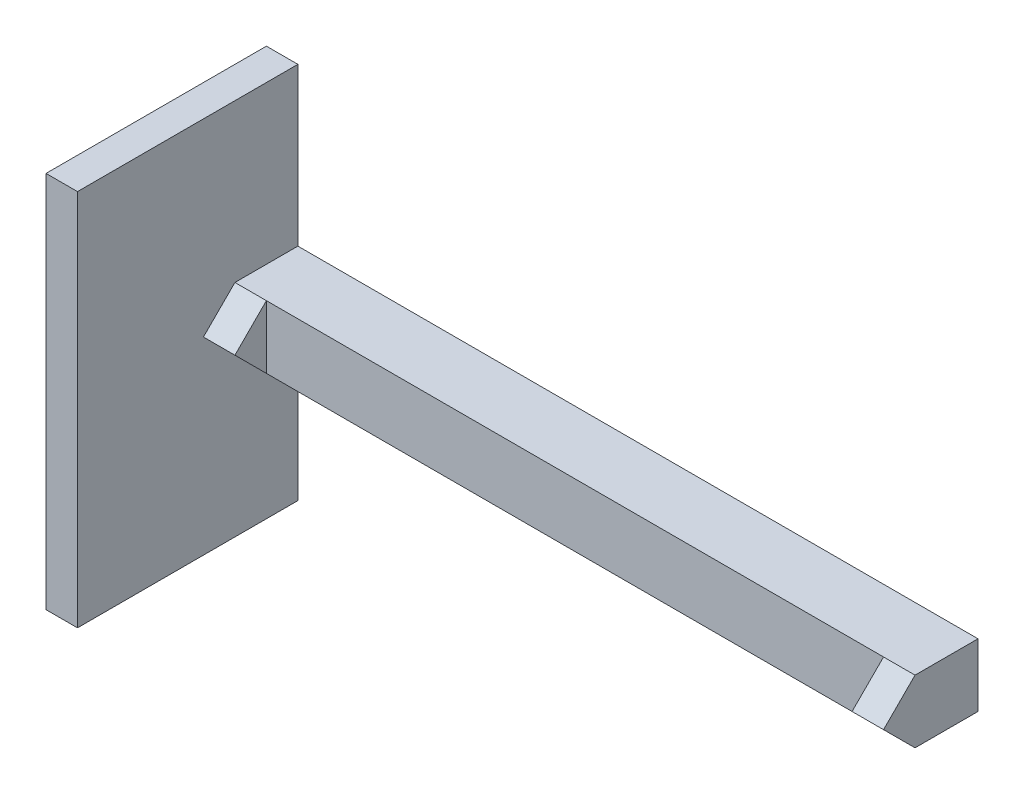
ISO-10303-21;
HEADER;
FILE_DESCRIPTION(('STEP AP214'),'2;1');
FILE_NAME('part.step','',(''),(''),'','','');
FILE_SCHEMA(('AUTOMOTIVE_DESIGN { 1 0 10303 214 1 1 1 1 }'));
ENDSEC;
DATA;
#1=APPLICATION_CONTEXT('core data for automotive mechanical design processes');
#2=APPLICATION_PROTOCOL_DEFINITION('international standard','automotive_design',2000,#1);
#3=PRODUCT_CONTEXT('',#1,'mechanical');
#4=PRODUCT('Part','Part','',(#3));
#5=PRODUCT_RELATED_PRODUCT_CATEGORY('part','',(#4));
#6=PRODUCT_DEFINITION_FORMATION('','',#4);
#7=PRODUCT_DEFINITION_CONTEXT('part definition',#1,'design');
#8=PRODUCT_DEFINITION('design','',#6,#7);
#9=PRODUCT_DEFINITION_SHAPE('','',#8);
#10=(LENGTH_UNIT() NAMED_UNIT(*) SI_UNIT(.MILLI.,.METRE.));
#11=(NAMED_UNIT(*) PLANE_ANGLE_UNIT() SI_UNIT($,.RADIAN.));
#12=(NAMED_UNIT(*) SI_UNIT($,.STERADIAN.) SOLID_ANGLE_UNIT());
#13=UNCERTAINTY_MEASURE_WITH_UNIT(LENGTH_MEASURE(1.E-05),#10,'distance_accuracy_value','');
#14=(GEOMETRIC_REPRESENTATION_CONTEXT(3) GLOBAL_UNCERTAINTY_ASSIGNED_CONTEXT((#13)) GLOBAL_UNIT_ASSIGNED_CONTEXT((#10,
#11,#12)) REPRESENTATION_CONTEXT('',''));
#15=CARTESIAN_POINT('',(0.,0.,0.));
#16=DIRECTION('',(0.,0.,1.));
#17=DIRECTION('',(1.,0.,0.));
#18=AXIS2_PLACEMENT_3D('',#15,#16,#17);
#19=CARTESIAN_POINT('',(0.,0.,10.));
#20=DIRECTION('',(0.,0.,-1.));
#21=DIRECTION('',(-1.,0.,0.));
#22=AXIS2_PLACEMENT_3D('',#19,#20,#21);
#23=PLANE('',#22);
#24=DIRECTION('',(0.,1.,0.));
#25=VECTOR('',#24,1.);
#26=CARTESIAN_POINT('',(-46.5,-4.99999999999999,10.));
#27=LINE('',#26,#25);
#28=CARTESIAN_POINT('',(-46.5,-5.,10.));
#29=VERTEX_POINT('',#28);
#30=CARTESIAN_POINT('',(-46.5,5.,10.));
#31=VERTEX_POINT('',#30);
#32=EDGE_CURVE('E66',#29,#31,#27,.T.);
#33=ORIENTED_EDGE('',*,*,#32,.F.);
#34=DIRECTION('',(1.,0.,0.));
#35=VECTOR('',#34,1.);
#36=CARTESIAN_POINT('',(56.5,-5.,10.));
#37=LINE('',#36,#35);
#38=CARTESIAN_POINT('',(51.5,-4.99999999999999,10.));
#39=VERTEX_POINT('',#38);
#40=EDGE_CURVE('E249',#29,#39,#37,.T.);
#41=ORIENTED_EDGE('',*,*,#40,.T.);
#42=DIRECTION('',(0.,1.,0.));
#43=VECTOR('',#42,1.);
#44=CARTESIAN_POINT('',(51.5,-4.99999999999999,10.));
#45=LINE('',#44,#43);
#46=CARTESIAN_POINT('',(51.5,5.,10.));
#47=VERTEX_POINT('',#46);
#48=EDGE_CURVE('E216',#39,#47,#45,.T.);
#49=ORIENTED_EDGE('',*,*,#48,.T.);
#50=DIRECTION('',(-1.,0.,0.));
#51=VECTOR('',#50,1.);
#52=CARTESIAN_POINT('',(56.5,5.,10.));
#53=LINE('',#52,#51);
#54=EDGE_CURVE('E252',#47,#31,#53,.T.);
#55=ORIENTED_EDGE('',*,*,#54,.T.);
#56=EDGE_LOOP('',(#33,#41,#49,#55));
#57=FACE_BOUND('',#56,.T.);
#58=ADVANCED_FACE('F50',(#57),#23,.F.);
#59=CARTESIAN_POINT('',(56.5,5.,10.));
#60=DIRECTION('',(0.,-1.,0.));
#61=DIRECTION('',(0.,0.,-1.));
#62=AXIS2_PLACEMENT_3D('',#59,#60,#61);
#63=PLANE('',#62);
#64=DIRECTION('',(-1.,0.,0.));
#65=VECTOR('',#64,1.);
#66=CARTESIAN_POINT('',(56.5,5.,0.));
#67=LINE('',#66,#65);
#68=CARTESIAN_POINT('',(56.5,5.,0.));
#69=VERTEX_POINT('',#68);
#70=CARTESIAN_POINT('',(-51.5,5.,0.));
#71=VERTEX_POINT('',#70);
#72=EDGE_CURVE('E243',#69,#71,#67,.T.);
#73=ORIENTED_EDGE('',*,*,#72,.T.);
#74=DIRECTION('',(0.,0.,1.));
#75=VECTOR('',#74,1.);
#76=CARTESIAN_POINT('',(-51.5,5.,10.));
#77=LINE('',#76,#75);
#78=CARTESIAN_POINT('',(-51.5,5.,10.));
#79=VERTEX_POINT('',#78);
#80=EDGE_CURVE('E218',#71,#79,#77,.T.);
#81=ORIENTED_EDGE('',*,*,#80,.T.);
#82=DIRECTION('',(-1.,0.,0.));
#83=VECTOR('',#82,1.);
#84=CARTESIAN_POINT('',(-46.5,5.,10.));
#85=LINE('',#84,#83);
#86=EDGE_CURVE('E65',#31,#79,#85,.T.);
#87=ORIENTED_EDGE('',*,*,#86,.F.);
#88=ORIENTED_EDGE('',*,*,#54,.F.);
#89=CARTESIAN_POINT('',(56.5,5.00000000000001,10.));
#90=VERTEX_POINT('',#89);
#91=EDGE_CURVE('E246',#90,#47,#53,.T.);
#92=ORIENTED_EDGE('',*,*,#91,.F.);
#93=DIRECTION('',(0.,0.,-1.));
#94=VECTOR('',#93,1.);
#95=CARTESIAN_POINT('',(56.5,5.,10.));
#96=LINE('',#95,#94);
#97=EDGE_CURVE('E57',#90,#69,#96,.T.);
#98=ORIENTED_EDGE('',*,*,#97,.T.);
#99=EDGE_LOOP('',(#73,#81,#87,#88,#92,#98));
#100=FACE_BOUND('',#99,.T.);
#101=ADVANCED_FACE('F47',(#100),#63,.F.);
#102=CARTESIAN_POINT('',(-56.5,-5.,10.));
#103=DIRECTION('',(1.,0.,0.));
#104=DIRECTION('',(0.,0.,-1.));
#105=AXIS2_PLACEMENT_3D('',#102,#103,#104);
#106=PLANE('',#105);
#107=DIRECTION('',(0.,-1.,0.));
#108=VECTOR('',#107,1.);
#109=CARTESIAN_POINT('',(-56.5,-5.,0.));
#110=LINE('',#109,#108);
#111=CARTESIAN_POINT('',(-56.5,30.,0.));
#112=VERTEX_POINT('',#111);
#113=CARTESIAN_POINT('',(-56.5,-30.,0.));
#114=VERTEX_POINT('',#113);
#115=EDGE_CURVE('E259',#112,#114,#110,.T.);
#116=ORIENTED_EDGE('',*,*,#115,.T.);
#117=DIRECTION('',(0.,0.,1.));
#118=VECTOR('',#117,1.);
#119=CARTESIAN_POINT('',(-56.5,-30.,0.));
#120=LINE('',#119,#118);
#121=CARTESIAN_POINT('',(-56.5,-30.,35.));
#122=VERTEX_POINT('',#121);
#123=EDGE_CURVE('E195',#114,#122,#120,.T.);
#124=ORIENTED_EDGE('',*,*,#123,.T.);
#125=DIRECTION('',(0.,1.,0.));
#126=VECTOR('',#125,1.);
#127=CARTESIAN_POINT('',(-56.5,30.,35.));
#128=LINE('',#127,#126);
#129=CARTESIAN_POINT('',(-56.5,30.,35.));
#130=VERTEX_POINT('',#129);
#131=EDGE_CURVE('E176',#122,#130,#128,.T.);
#132=ORIENTED_EDGE('',*,*,#131,.T.);
#133=DIRECTION('',(0.,0.,-1.));
#134=VECTOR('',#133,1.);
#135=CARTESIAN_POINT('',(-56.5,30.,0.));
#136=LINE('',#135,#134);
#137=EDGE_CURVE('E167',#130,#112,#136,.T.);
#138=ORIENTED_EDGE('',*,*,#137,.T.);
#139=EDGE_LOOP('',(#116,#124,#132,#138));
#140=FACE_BOUND('',#139,.T.);
#141=ADVANCED_FACE('F323',(#140),#106,.F.);
#142=CARTESIAN_POINT('',(56.5,-5.,10.));
#143=DIRECTION('',(0.,1.,0.));
#144=DIRECTION('',(0.,0.,1.));
#145=AXIS2_PLACEMENT_3D('',#142,#143,#144);
#146=PLANE('',#145);
#147=CARTESIAN_POINT('',(-51.5,-5.,10.));
#148=VERTEX_POINT('',#147);
#149=EDGE_CURVE('E158',#148,#29,#37,.T.);
#150=ORIENTED_EDGE('',*,*,#149,.F.);
#151=DIRECTION('',(0.,0.,-1.));
#152=VECTOR('',#151,1.);
#153=CARTESIAN_POINT('',(-51.5,-5.,10.));
#154=LINE('',#153,#152);
#155=CARTESIAN_POINT('',(-51.5,-5.,0.));
#156=VERTEX_POINT('',#155);
#157=EDGE_CURVE('E203',#148,#156,#154,.T.);
#158=ORIENTED_EDGE('',*,*,#157,.T.);
#159=DIRECTION('',(1.,0.,0.));
#160=VECTOR('',#159,1.);
#161=CARTESIAN_POINT('',(56.5,-5.,0.));
#162=LINE('',#161,#160);
#163=CARTESIAN_POINT('',(56.5,-5.,0.));
#164=VERTEX_POINT('',#163);
#165=EDGE_CURVE('E258',#156,#164,#162,.T.);
#166=ORIENTED_EDGE('',*,*,#165,.T.);
#167=DIRECTION('',(0.,0.,-1.));
#168=VECTOR('',#167,1.);
#169=CARTESIAN_POINT('',(56.5,-5.,10.));
#170=LINE('',#169,#168);
#171=CARTESIAN_POINT('',(56.5,-4.99999999999999,10.));
#172=VERTEX_POINT('',#171);
#173=EDGE_CURVE('E11',#172,#164,#170,.T.);
#174=ORIENTED_EDGE('',*,*,#173,.F.);
#175=DIRECTION('',(1.,0.,0.));
#176=VECTOR('',#175,1.);
#177=CARTESIAN_POINT('',(51.5,-4.99999999999999,10.));
#178=LINE('',#177,#176);
#179=EDGE_CURVE('E239',#39,#172,#178,.T.);
#180=ORIENTED_EDGE('',*,*,#179,.F.);
#181=ORIENTED_EDGE('',*,*,#40,.F.);
#182=EDGE_LOOP('',(#150,#158,#166,#174,#180,#181));
#183=FACE_BOUND('',#182,.T.);
#184=ADVANCED_FACE('F306',(#183),#146,.F.);
#185=CARTESIAN_POINT('',(56.5,-5.,10.));
#186=DIRECTION('',(-1.,0.,0.));
#187=DIRECTION('',(0.,0.,1.));
#188=AXIS2_PLACEMENT_3D('',#185,#186,#187);
#189=PLANE('',#188);
#190=DIRECTION('',(0.,1.,0.));
#191=VECTOR('',#190,1.);
#192=CARTESIAN_POINT('',(56.5,-5.,0.));
#193=LINE('',#192,#191);
#194=EDGE_CURVE('E264',#164,#69,#193,.T.);
#195=ORIENTED_EDGE('',*,*,#194,.T.);
#196=ORIENTED_EDGE('',*,*,#97,.F.);
#197=DIRECTION('',(0.,-0.707106781186548,0.707106781186547));
#198=VECTOR('',#197,1.);
#199=CARTESIAN_POINT('',(56.5,0.,15.));
#200=LINE('',#199,#198);
#201=CARTESIAN_POINT('',(56.5,0.,15.));
#202=VERTEX_POINT('',#201);
#203=EDGE_CURVE('E220',#90,#202,#200,.T.);
#204=ORIENTED_EDGE('',*,*,#203,.T.);
#205=DIRECTION('',(0.,-0.707106781186547,-0.707106781186548));
#206=VECTOR('',#205,1.);
#207=CARTESIAN_POINT('',(56.5,-4.99999999999999,10.));
#208=LINE('',#207,#206);
#209=EDGE_CURVE('E224',#202,#172,#208,.T.);
#210=ORIENTED_EDGE('',*,*,#209,.T.);
#211=ORIENTED_EDGE('',*,*,#173,.T.);
#212=EDGE_LOOP('',(#195,#196,#204,#210,#211));
#213=FACE_BOUND('',#212,.T.);
#214=ADVANCED_FACE('F310',(#213),#189,.F.);
#215=CARTESIAN_POINT('',(0.,0.,0.));
#216=DIRECTION('',(0.,0.,-1.));
#217=DIRECTION('',(-1.,0.,0.));
#218=AXIS2_PLACEMENT_3D('',#215,#216,#217);
#219=PLANE('',#218);
#220=ORIENTED_EDGE('',*,*,#165,.F.);
#221=DIRECTION('',(0.,-1.,0.));
#222=VECTOR('',#221,1.);
#223=CARTESIAN_POINT('',(-51.5,30.,0.));
#224=LINE('',#223,#222);
#225=CARTESIAN_POINT('',(-51.5,-30.,0.));
#226=VERTEX_POINT('',#225);
#227=EDGE_CURVE('E174',#156,#226,#224,.T.);
#228=ORIENTED_EDGE('',*,*,#227,.T.);
#229=DIRECTION('',(-1.,0.,0.));
#230=VECTOR('',#229,1.);
#231=CARTESIAN_POINT('',(-51.5,-30.,0.));
#232=LINE('',#231,#230);
#233=EDGE_CURVE('E210',#226,#114,#232,.T.);
#234=ORIENTED_EDGE('',*,*,#233,.T.);
#235=ORIENTED_EDGE('',*,*,#115,.F.);
#236=DIRECTION('',(-1.,0.,0.));
#237=VECTOR('',#236,1.);
#238=CARTESIAN_POINT('',(-51.5,30.,0.));
#239=LINE('',#238,#237);
#240=CARTESIAN_POINT('',(-51.5,30.,0.));
#241=VERTEX_POINT('',#240);
#242=EDGE_CURVE('E186',#241,#112,#239,.T.);
#243=ORIENTED_EDGE('',*,*,#242,.F.);
#244=EDGE_CURVE('E180',#241,#71,#224,.T.);
#245=ORIENTED_EDGE('',*,*,#244,.T.);
#246=ORIENTED_EDGE('',*,*,#72,.F.);
#247=ORIENTED_EDGE('',*,*,#194,.F.);
#248=EDGE_LOOP('',(#220,#228,#234,#235,#243,#245,#246,#247));
#249=FACE_BOUND('',#248,.T.);
#250=ADVANCED_FACE('F274',(#249),#219,.T.);
#251=CARTESIAN_POINT('',(51.5,-4.99999999999999,10.));
#252=DIRECTION('',(0.,-0.707106781186548,0.707106781186547));
#253=DIRECTION('',(0.,-0.707106781186547,-0.707106781186548));
#254=AXIS2_PLACEMENT_3D('',#251,#252,#253);
#255=PLANE('',#254);
#256=ORIENTED_EDGE('',*,*,#209,.F.);
#257=DIRECTION('',(1.,0.,0.));
#258=VECTOR('',#257,1.);
#259=CARTESIAN_POINT('',(51.5,0.,15.));
#260=LINE('',#259,#258);
#261=CARTESIAN_POINT('',(51.5,0.,15.));
#262=VERTEX_POINT('',#261);
#263=EDGE_CURVE('E231',#262,#202,#260,.T.);
#264=ORIENTED_EDGE('',*,*,#263,.F.);
#265=DIRECTION('',(0.,-0.707106781186547,-0.707106781186548));
#266=VECTOR('',#265,1.);
#267=CARTESIAN_POINT('',(51.5,-4.99999999999999,10.));
#268=LINE('',#267,#266);
#269=EDGE_CURVE('E230',#262,#39,#268,.T.);
#270=ORIENTED_EDGE('',*,*,#269,.T.);
#271=ORIENTED_EDGE('',*,*,#179,.T.);
#272=EDGE_LOOP('',(#256,#264,#270,#271));
#273=FACE_BOUND('',#272,.T.);
#274=ADVANCED_FACE('F302',(#273),#255,.T.);
#275=CARTESIAN_POINT('',(51.5,0.,15.));
#276=DIRECTION('',(0.,0.707106781186547,0.707106781186548));
#277=DIRECTION('',(0.,-0.707106781186548,0.707106781186547));
#278=AXIS2_PLACEMENT_3D('',#275,#276,#277);
#279=PLANE('',#278);
#280=ORIENTED_EDGE('',*,*,#203,.F.);
#281=ORIENTED_EDGE('',*,*,#91,.T.);
#282=DIRECTION('',(0.,-0.707106781186548,0.707106781186547));
#283=VECTOR('',#282,1.);
#284=CARTESIAN_POINT('',(51.5,0.,15.));
#285=LINE('',#284,#283);
#286=EDGE_CURVE('E222',#47,#262,#285,.T.);
#287=ORIENTED_EDGE('',*,*,#286,.T.);
#288=ORIENTED_EDGE('',*,*,#263,.T.);
#289=EDGE_LOOP('',(#280,#281,#287,#288));
#290=FACE_BOUND('',#289,.T.);
#291=ADVANCED_FACE('F307',(#290),#279,.T.);
#292=CARTESIAN_POINT('',(51.5,0.,0.));
#293=DIRECTION('',(-1.,0.,0.));
#294=DIRECTION('',(0.,0.,1.));
#295=AXIS2_PLACEMENT_3D('',#292,#293,#294);
#296=PLANE('',#295);
#297=ORIENTED_EDGE('',*,*,#48,.F.);
#298=ORIENTED_EDGE('',*,*,#269,.F.);
#299=ORIENTED_EDGE('',*,*,#286,.F.);
#300=EDGE_LOOP('',(#297,#298,#299));
#301=FACE_BOUND('',#300,.T.);
#302=ADVANCED_FACE('F301',(#301),#296,.T.);
#303=CARTESIAN_POINT('',(-51.5,0.,0.));
#304=DIRECTION('',(1.,0.,0.));
#305=DIRECTION('',(0.,0.,-1.));
#306=AXIS2_PLACEMENT_3D('',#303,#304,#305);
#307=PLANE('',#306);
#308=DIRECTION('',(0.,-0.707106781186547,-0.707106781186548));
#309=VECTOR('',#308,1.);
#310=CARTESIAN_POINT('',(-51.5,0.,15.));
#311=LINE('',#310,#309);
#312=CARTESIAN_POINT('',(-51.5,0.,15.));
#313=VERTEX_POINT('',#312);
#314=EDGE_CURVE('E164',#313,#148,#311,.T.);
#315=ORIENTED_EDGE('',*,*,#314,.F.);
#316=DIRECTION('',(0.,-0.707106781186548,0.707106781186548));
#317=VECTOR('',#316,1.);
#318=CARTESIAN_POINT('',(-51.5,5.,10.));
#319=LINE('',#318,#317);
#320=EDGE_CURVE('E154',#79,#313,#319,.T.);
#321=ORIENTED_EDGE('',*,*,#320,.F.);
#322=ORIENTED_EDGE('',*,*,#80,.F.);
#323=ORIENTED_EDGE('',*,*,#244,.F.);
#324=DIRECTION('',(0.,0.,-1.));
#325=VECTOR('',#324,1.);
#326=CARTESIAN_POINT('',(-51.5,30.,0.));
#327=LINE('',#326,#325);
#328=CARTESIAN_POINT('',(-51.5,30.,35.));
#329=VERTEX_POINT('',#328);
#330=EDGE_CURVE('E171',#329,#241,#327,.T.);
#331=ORIENTED_EDGE('',*,*,#330,.F.);
#332=DIRECTION('',(0.,1.,0.));
#333=VECTOR('',#332,1.);
#334=CARTESIAN_POINT('',(-51.5,30.,35.));
#335=LINE('',#334,#333);
#336=CARTESIAN_POINT('',(-51.5,-30.,35.));
#337=VERTEX_POINT('',#336);
#338=EDGE_CURVE('E184',#337,#329,#335,.T.);
#339=ORIENTED_EDGE('',*,*,#338,.F.);
#340=DIRECTION('',(0.,0.,1.));
#341=VECTOR('',#340,1.);
#342=CARTESIAN_POINT('',(-51.5,-30.,0.));
#343=LINE('',#342,#341);
#344=EDGE_CURVE('E181',#226,#337,#343,.T.);
#345=ORIENTED_EDGE('',*,*,#344,.F.);
#346=ORIENTED_EDGE('',*,*,#227,.F.);
#347=ORIENTED_EDGE('',*,*,#157,.F.);
#348=EDGE_LOOP('',(#315,#321,#322,#323,#331,#339,#345,#346,#347));
#349=FACE_BOUND('',#348,.T.);
#350=ADVANCED_FACE('F280',(#349),#307,.T.);
#351=CARTESIAN_POINT('',(-51.5,30.,0.));
#352=DIRECTION('',(0.,1.,0.));
#353=DIRECTION('',(0.,0.,1.));
#354=AXIS2_PLACEMENT_3D('',#351,#352,#353);
#355=PLANE('',#354);
#356=ORIENTED_EDGE('',*,*,#137,.F.);
#357=DIRECTION('',(-1.,0.,0.));
#358=VECTOR('',#357,1.);
#359=CARTESIAN_POINT('',(-51.5,30.,35.));
#360=LINE('',#359,#358);
#361=EDGE_CURVE('E196',#329,#130,#360,.T.);
#362=ORIENTED_EDGE('',*,*,#361,.F.);
#363=ORIENTED_EDGE('',*,*,#330,.T.);
#364=ORIENTED_EDGE('',*,*,#242,.T.);
#365=EDGE_LOOP('',(#356,#362,#363,#364));
#366=FACE_BOUND('',#365,.T.);
#367=ADVANCED_FACE('F284',(#366),#355,.T.);
#368=CARTESIAN_POINT('',(-51.5,30.,35.));
#369=DIRECTION('',(0.,0.,1.));
#370=DIRECTION('',(0.,-1.,0.));
#371=AXIS2_PLACEMENT_3D('',#368,#369,#370);
#372=PLANE('',#371);
#373=ORIENTED_EDGE('',*,*,#131,.F.);
#374=DIRECTION('',(-1.,0.,0.));
#375=VECTOR('',#374,1.);
#376=CARTESIAN_POINT('',(-51.5,-30.,35.));
#377=LINE('',#376,#375);
#378=EDGE_CURVE('E202',#337,#122,#377,.T.);
#379=ORIENTED_EDGE('',*,*,#378,.F.);
#380=ORIENTED_EDGE('',*,*,#338,.T.);
#381=ORIENTED_EDGE('',*,*,#361,.T.);
#382=EDGE_LOOP('',(#373,#379,#380,#381));
#383=FACE_BOUND('',#382,.T.);
#384=ADVANCED_FACE('F281',(#383),#372,.T.);
#385=CARTESIAN_POINT('',(-51.5,-30.,0.));
#386=DIRECTION('',(0.,-1.,0.));
#387=DIRECTION('',(0.,0.,-1.));
#388=AXIS2_PLACEMENT_3D('',#385,#386,#387);
#389=PLANE('',#388);
#390=ORIENTED_EDGE('',*,*,#123,.F.);
#391=ORIENTED_EDGE('',*,*,#233,.F.);
#392=ORIENTED_EDGE('',*,*,#344,.T.);
#393=ORIENTED_EDGE('',*,*,#378,.T.);
#394=EDGE_LOOP('',(#390,#391,#392,#393));
#395=FACE_BOUND('',#394,.T.);
#396=ADVANCED_FACE('F292',(#395),#389,.T.);
#397=CARTESIAN_POINT('',(-46.5,5.,10.));
#398=DIRECTION('',(0.,-0.707106781186548,-0.707106781186548));
#399=DIRECTION('',(0.,0.707106781186548,-0.707106781186548));
#400=AXIS2_PLACEMENT_3D('',#397,#398,#399);
#401=PLANE('',#400);
#402=ORIENTED_EDGE('',*,*,#320,.T.);
#403=DIRECTION('',(-1.,0.,0.));
#404=VECTOR('',#403,1.);
#405=CARTESIAN_POINT('',(-46.5,0.,15.));
#406=LINE('',#405,#404);
#407=CARTESIAN_POINT('',(-46.5,0.,15.));
#408=VERTEX_POINT('',#407);
#409=EDGE_CURVE('E147',#408,#313,#406,.T.);
#410=ORIENTED_EDGE('',*,*,#409,.F.);
#411=DIRECTION('',(0.,-0.707106781186548,0.707106781186548));
#412=VECTOR('',#411,1.);
#413=CARTESIAN_POINT('',(-46.5,5.,10.));
#414=LINE('',#413,#412);
#415=EDGE_CURVE('E137',#31,#408,#414,.T.);
#416=ORIENTED_EDGE('',*,*,#415,.F.);
#417=ORIENTED_EDGE('',*,*,#86,.T.);
#418=EDGE_LOOP('',(#402,#410,#416,#417));
#419=FACE_BOUND('',#418,.T.);
#420=ADVANCED_FACE('F153',(#419),#401,.F.);
#421=CARTESIAN_POINT('',(-46.5,0.,15.));
#422=DIRECTION('',(0.,0.707106781186548,-0.707106781186547));
#423=DIRECTION('',(0.,0.707106781186547,0.707106781186548));
#424=AXIS2_PLACEMENT_3D('',#421,#422,#423);
#425=PLANE('',#424);
#426=ORIENTED_EDGE('',*,*,#314,.T.);
#427=ORIENTED_EDGE('',*,*,#149,.T.);
#428=DIRECTION('',(0.,-0.707106781186547,-0.707106781186548));
#429=VECTOR('',#428,1.);
#430=CARTESIAN_POINT('',(-46.5,0.,15.));
#431=LINE('',#430,#429);
#432=EDGE_CURVE('E141',#408,#29,#431,.T.);
#433=ORIENTED_EDGE('',*,*,#432,.F.);
#434=ORIENTED_EDGE('',*,*,#409,.T.);
#435=EDGE_LOOP('',(#426,#427,#433,#434));
#436=FACE_BOUND('',#435,.T.);
#437=ADVANCED_FACE('F160',(#436),#425,.F.);
#438=CARTESIAN_POINT('',(-46.5,0.,0.));
#439=DIRECTION('',(1.,0.,0.));
#440=DIRECTION('',(0.,0.,-1.));
#441=AXIS2_PLACEMENT_3D('',#438,#439,#440);
#442=PLANE('',#441);
#443=ORIENTED_EDGE('',*,*,#32,.T.);
#444=ORIENTED_EDGE('',*,*,#415,.T.);
#445=ORIENTED_EDGE('',*,*,#432,.T.);
#446=EDGE_LOOP('',(#443,#444,#445));
#447=FACE_BOUND('',#446,.T.);
#448=ADVANCED_FACE('F142',(#447),#442,.T.);
#449=CLOSED_SHELL('',(#58,#101,#141,#184,#214,#250,#274,#291,#302,#350,#367,#384,#396,#420,#437,#448));
#450=MANIFOLD_SOLID_BREP('B2',#449);
#451=ADVANCED_BREP_SHAPE_REPRESENTATION('',(#18,#450),#14);
#452=SHAPE_DEFINITION_REPRESENTATION(#9,#451);
ENDSEC;
END-ISO-10303-21;
